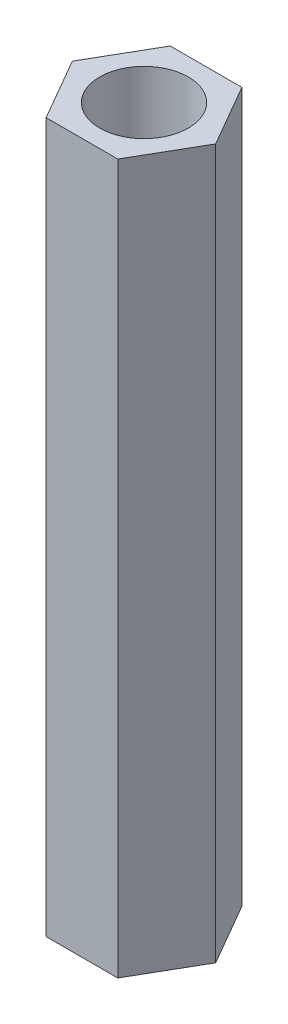
ISO-10303-21;
HEADER;
FILE_DESCRIPTION(('STEP AP214'),'2;1');
FILE_NAME('part.step','',(''),(''),'','','');
FILE_SCHEMA(('AUTOMOTIVE_DESIGN { 1 0 10303 214 1 1 1 1 }'));
ENDSEC;
DATA;
#1=APPLICATION_CONTEXT('core data for automotive mechanical design processes');
#2=APPLICATION_PROTOCOL_DEFINITION('international standard','automotive_design',2000,#1);
#3=PRODUCT_CONTEXT('',#1,'mechanical');
#4=PRODUCT('Part','Part','',(#3));
#5=PRODUCT_RELATED_PRODUCT_CATEGORY('part','',(#4));
#6=PRODUCT_DEFINITION_FORMATION('','',#4);
#7=PRODUCT_DEFINITION_CONTEXT('part definition',#1,'design');
#8=PRODUCT_DEFINITION('design','',#6,#7);
#9=PRODUCT_DEFINITION_SHAPE('','',#8);
#10=(LENGTH_UNIT() NAMED_UNIT(*) SI_UNIT(.MILLI.,.METRE.));
#11=(NAMED_UNIT(*) PLANE_ANGLE_UNIT() SI_UNIT($,.RADIAN.));
#12=(NAMED_UNIT(*) SI_UNIT($,.STERADIAN.) SOLID_ANGLE_UNIT());
#13=UNCERTAINTY_MEASURE_WITH_UNIT(LENGTH_MEASURE(1.E-05),#10,'distance_accuracy_value','');
#14=(GEOMETRIC_REPRESENTATION_CONTEXT(3) GLOBAL_UNCERTAINTY_ASSIGNED_CONTEXT((#13)) GLOBAL_UNIT_ASSIGNED_CONTEXT((#10,
#11,#12)) REPRESENTATION_CONTEXT('',''));
#15=CARTESIAN_POINT('',(0.,0.,0.));
#16=DIRECTION('',(0.,0.,1.));
#17=DIRECTION('',(1.,0.,0.));
#18=AXIS2_PLACEMENT_3D('',#15,#16,#17);
#19=CARTESIAN_POINT('',(0.,40.,0.));
#20=DIRECTION('',(0.,1.,0.));
#21=DIRECTION('',(0.,0.,1.));
#22=AXIS2_PLACEMENT_3D('',#19,#20,#21);
#23=PLANE('',#22);
#24=DIRECTION('',(-0.5,0.,-0.866025403784438));
#25=VECTOR('',#24,1.);
#26=CARTESIAN_POINT('',(4.04145188432738,40.,0.));
#27=LINE('',#26,#25);
#28=CARTESIAN_POINT('',(4.04145188432738,40.,0.));
#29=VERTEX_POINT('',#28);
#30=CARTESIAN_POINT('',(2.02072594216371,40.,-3.49999999999999));
#31=VERTEX_POINT('',#30);
#32=EDGE_CURVE('E152',#29,#31,#27,.T.);
#33=ORIENTED_EDGE('',*,*,#32,.T.);
#34=DIRECTION('',(-1.,0.,0.));
#35=VECTOR('',#34,1.);
#36=CARTESIAN_POINT('',(2.02072594216371,40.,-3.49999999999999));
#37=LINE('',#36,#35);
#38=CARTESIAN_POINT('',(-2.0207259421637,40.,-3.5));
#39=VERTEX_POINT('',#38);
#40=EDGE_CURVE('E100',#31,#39,#37,.T.);
#41=ORIENTED_EDGE('',*,*,#40,.T.);
#42=DIRECTION('',(-0.500000000000001,0.,0.866025403784438));
#43=VECTOR('',#42,1.);
#44=CARTESIAN_POINT('',(-2.0207259421637,40.,-3.5));
#45=LINE('',#44,#43);
#46=CARTESIAN_POINT('',(-4.04145188432739,40.,0.));
#47=VERTEX_POINT('',#46);
#48=EDGE_CURVE('E113',#39,#47,#45,.T.);
#49=ORIENTED_EDGE('',*,*,#48,.T.);
#50=DIRECTION('',(0.500000000000001,0.,0.866025403784438));
#51=VECTOR('',#50,1.);
#52=CARTESIAN_POINT('',(-4.04145188432739,40.,0.));
#53=LINE('',#52,#51);
#54=CARTESIAN_POINT('',(-2.0207259421637,40.,3.5));
#55=VERTEX_POINT('',#54);
#56=EDGE_CURVE('E107',#47,#55,#53,.T.);
#57=ORIENTED_EDGE('',*,*,#56,.T.);
#58=DIRECTION('',(1.,0.,0.));
#59=VECTOR('',#58,1.);
#60=CARTESIAN_POINT('',(-2.0207259421637,40.,3.5));
#61=LINE('',#60,#59);
#62=CARTESIAN_POINT('',(2.02072594216369,40.,3.5));
#63=VERTEX_POINT('',#62);
#64=EDGE_CURVE('E111',#55,#63,#61,.T.);
#65=ORIENTED_EDGE('',*,*,#64,.T.);
#66=DIRECTION('',(0.5,0.,-0.866025403784438));
#67=VECTOR('',#66,1.);
#68=CARTESIAN_POINT('',(2.02072594216369,40.,3.5));
#69=LINE('',#68,#67);
#70=EDGE_CURVE('E63',#63,#29,#69,.T.);
#71=ORIENTED_EDGE('',*,*,#70,.T.);
#72=EDGE_LOOP('',(#33,#41,#49,#57,#65,#71));
#73=FACE_BOUND('',#72,.T.);
#74=CARTESIAN_POINT('',(0.,40.,0.));
#75=DIRECTION('',(0.,1.,0.));
#76=DIRECTION('',(0.,0.,1.));
#77=AXIS2_PLACEMENT_3D('',#74,#75,#76);
#78=CIRCLE('',#77,2.5);
#79=CARTESIAN_POINT('',(0.,40.,2.5));
#80=VERTEX_POINT('',#79);
#81=EDGE_CURVE('E140',#80,#80,#78,.T.);
#82=ORIENTED_EDGE('',*,*,#81,.F.);
#83=EDGE_LOOP('',(#82));
#84=FACE_BOUND('',#83,.T.);
#85=ADVANCED_FACE('F45',(#73,#84),#23,.T.);
#86=CARTESIAN_POINT('',(0.,0.,0.));
#87=DIRECTION('',(0.,1.,0.));
#88=DIRECTION('',(0.,0.,1.));
#89=AXIS2_PLACEMENT_3D('',#86,#87,#88);
#90=PLANE('',#89);
#91=DIRECTION('',(-0.5,0.,-0.866025403784438));
#92=VECTOR('',#91,1.);
#93=CARTESIAN_POINT('',(4.04145188432738,0.,0.));
#94=LINE('',#93,#92);
#95=CARTESIAN_POINT('',(4.04145188432738,0.,0.));
#96=VERTEX_POINT('',#95);
#97=CARTESIAN_POINT('',(2.02072594216371,0.,-3.49999999999999));
#98=VERTEX_POINT('',#97);
#99=EDGE_CURVE('E135',#96,#98,#94,.T.);
#100=ORIENTED_EDGE('',*,*,#99,.F.);
#101=DIRECTION('',(0.5,0.,-0.866025403784438));
#102=VECTOR('',#101,1.);
#103=CARTESIAN_POINT('',(2.02072594216369,0.,3.5));
#104=LINE('',#103,#102);
#105=CARTESIAN_POINT('',(2.02072594216369,0.,3.5));
#106=VERTEX_POINT('',#105);
#107=EDGE_CURVE('E92',#106,#96,#104,.T.);
#108=ORIENTED_EDGE('',*,*,#107,.F.);
#109=DIRECTION('',(1.,0.,0.));
#110=VECTOR('',#109,1.);
#111=CARTESIAN_POINT('',(-2.0207259421637,0.,3.5));
#112=LINE('',#111,#110);
#113=CARTESIAN_POINT('',(-2.0207259421637,0.,3.5));
#114=VERTEX_POINT('',#113);
#115=EDGE_CURVE('E86',#114,#106,#112,.T.);
#116=ORIENTED_EDGE('',*,*,#115,.F.);
#117=DIRECTION('',(0.500000000000001,0.,0.866025403784438));
#118=VECTOR('',#117,1.);
#119=CARTESIAN_POINT('',(-4.04145188432739,0.,0.));
#120=LINE('',#119,#118);
#121=CARTESIAN_POINT('',(-4.04145188432739,0.,0.));
#122=VERTEX_POINT('',#121);
#123=EDGE_CURVE('E122',#122,#114,#120,.T.);
#124=ORIENTED_EDGE('',*,*,#123,.F.);
#125=DIRECTION('',(-0.500000000000001,0.,0.866025403784438));
#126=VECTOR('',#125,1.);
#127=CARTESIAN_POINT('',(-2.0207259421637,0.,-3.5));
#128=LINE('',#127,#126);
#129=CARTESIAN_POINT('',(-2.0207259421637,0.,-3.5));
#130=VERTEX_POINT('',#129);
#131=EDGE_CURVE('E143',#130,#122,#128,.T.);
#132=ORIENTED_EDGE('',*,*,#131,.F.);
#133=DIRECTION('',(-1.,0.,0.));
#134=VECTOR('',#133,1.);
#135=CARTESIAN_POINT('',(2.02072594216371,0.,-3.49999999999999));
#136=LINE('',#135,#134);
#137=EDGE_CURVE('E139',#98,#130,#136,.T.);
#138=ORIENTED_EDGE('',*,*,#137,.F.);
#139=EDGE_LOOP('',(#100,#108,#116,#124,#132,#138));
#140=FACE_BOUND('',#139,.T.);
#141=CARTESIAN_POINT('',(0.,0.,0.));
#142=DIRECTION('',(0.,1.,0.));
#143=DIRECTION('',(0.,0.,1.));
#144=AXIS2_PLACEMENT_3D('',#141,#142,#143);
#145=CIRCLE('',#144,2.5);
#146=CARTESIAN_POINT('',(0.,0.,2.5));
#147=VERTEX_POINT('',#146);
#148=EDGE_CURVE('E249',#147,#147,#145,.T.);
#149=ORIENTED_EDGE('',*,*,#148,.T.);
#150=EDGE_LOOP('',(#149));
#151=FACE_BOUND('',#150,.T.);
#152=ADVANCED_FACE('F165',(#140,#151),#90,.F.);
#153=CARTESIAN_POINT('',(4.04145188432738,40.,0.));
#154=DIRECTION('',(-0.866025403784439,0.,0.5));
#155=DIRECTION('',(0.5,0.,0.866025403784439));
#156=AXIS2_PLACEMENT_3D('',#153,#154,#155);
#157=PLANE('',#156);
#158=ORIENTED_EDGE('',*,*,#99,.T.);
#159=DIRECTION('',(0.,-1.,0.));
#160=VECTOR('',#159,1.);
#161=CARTESIAN_POINT('',(2.02072594216371,40.,-3.49999999999999));
#162=LINE('',#161,#160);
#163=EDGE_CURVE('E11',#31,#98,#162,.T.);
#164=ORIENTED_EDGE('',*,*,#163,.F.);
#165=ORIENTED_EDGE('',*,*,#32,.F.);
#166=DIRECTION('',(0.,-1.,0.));
#167=VECTOR('',#166,1.);
#168=CARTESIAN_POINT('',(4.04145188432738,40.,0.));
#169=LINE('',#168,#167);
#170=EDGE_CURVE('E131',#29,#96,#169,.T.);
#171=ORIENTED_EDGE('',*,*,#170,.T.);
#172=EDGE_LOOP('',(#158,#164,#165,#171));
#173=FACE_BOUND('',#172,.T.);
#174=ADVANCED_FACE('F47',(#173),#157,.F.);
#175=CARTESIAN_POINT('',(2.02072594216371,40.,-3.49999999999999));
#176=DIRECTION('',(0.,0.,1.));
#177=DIRECTION('',(1.,0.,0.));
#178=AXIS2_PLACEMENT_3D('',#175,#176,#177);
#179=PLANE('',#178);
#180=ORIENTED_EDGE('',*,*,#137,.T.);
#181=DIRECTION('',(0.,-1.,0.));
#182=VECTOR('',#181,1.);
#183=CARTESIAN_POINT('',(-2.0207259421637,40.,-3.5));
#184=LINE('',#183,#182);
#185=EDGE_CURVE('E55',#39,#130,#184,.T.);
#186=ORIENTED_EDGE('',*,*,#185,.F.);
#187=ORIENTED_EDGE('',*,*,#40,.F.);
#188=ORIENTED_EDGE('',*,*,#163,.T.);
#189=EDGE_LOOP('',(#180,#186,#187,#188));
#190=FACE_BOUND('',#189,.T.);
#191=ADVANCED_FACE('F190',(#190),#179,.F.);
#192=CARTESIAN_POINT('',(-2.0207259421637,40.,-3.5));
#193=DIRECTION('',(0.866025403784438,0.,0.500000000000001));
#194=DIRECTION('',(0.500000000000001,0.,-0.866025403784438));
#195=AXIS2_PLACEMENT_3D('',#192,#193,#194);
#196=PLANE('',#195);
#197=ORIENTED_EDGE('',*,*,#131,.T.);
#198=DIRECTION('',(0.,-1.,0.));
#199=VECTOR('',#198,1.);
#200=CARTESIAN_POINT('',(-4.04145188432739,40.,0.));
#201=LINE('',#200,#199);
#202=EDGE_CURVE('E124',#47,#122,#201,.T.);
#203=ORIENTED_EDGE('',*,*,#202,.F.);
#204=ORIENTED_EDGE('',*,*,#48,.F.);
#205=ORIENTED_EDGE('',*,*,#185,.T.);
#206=EDGE_LOOP('',(#197,#203,#204,#205));
#207=FACE_BOUND('',#206,.T.);
#208=ADVANCED_FACE('F162',(#207),#196,.F.);
#209=CARTESIAN_POINT('',(-4.04145188432739,40.,0.));
#210=DIRECTION('',(0.866025403784438,0.,-0.500000000000001));
#211=DIRECTION('',(-0.500000000000001,0.,-0.866025403784438));
#212=AXIS2_PLACEMENT_3D('',#209,#210,#211);
#213=PLANE('',#212);
#214=ORIENTED_EDGE('',*,*,#123,.T.);
#215=DIRECTION('',(0.,-1.,0.));
#216=VECTOR('',#215,1.);
#217=CARTESIAN_POINT('',(-2.0207259421637,40.,3.5));
#218=LINE('',#217,#216);
#219=EDGE_CURVE('E119',#55,#114,#218,.T.);
#220=ORIENTED_EDGE('',*,*,#219,.F.);
#221=ORIENTED_EDGE('',*,*,#56,.F.);
#222=ORIENTED_EDGE('',*,*,#202,.T.);
#223=EDGE_LOOP('',(#214,#220,#221,#222));
#224=FACE_BOUND('',#223,.T.);
#225=ADVANCED_FACE('F120',(#224),#213,.F.);
#226=CARTESIAN_POINT('',(-2.0207259421637,40.,3.5));
#227=DIRECTION('',(0.,0.,-1.));
#228=DIRECTION('',(-1.,0.,0.));
#229=AXIS2_PLACEMENT_3D('',#226,#227,#228);
#230=PLANE('',#229);
#231=ORIENTED_EDGE('',*,*,#115,.T.);
#232=DIRECTION('',(0.,-1.,0.));
#233=VECTOR('',#232,1.);
#234=CARTESIAN_POINT('',(2.02072594216369,40.,3.5));
#235=LINE('',#234,#233);
#236=EDGE_CURVE('E125',#63,#106,#235,.T.);
#237=ORIENTED_EDGE('',*,*,#236,.F.);
#238=ORIENTED_EDGE('',*,*,#64,.F.);
#239=ORIENTED_EDGE('',*,*,#219,.T.);
#240=EDGE_LOOP('',(#231,#237,#238,#239));
#241=FACE_BOUND('',#240,.T.);
#242=ADVANCED_FACE('F127',(#241),#230,.F.);
#243=CARTESIAN_POINT('',(2.02072594216369,40.,3.5));
#244=DIRECTION('',(-0.866025403784439,0.,-0.5));
#245=DIRECTION('',(-0.5,0.,0.866025403784439));
#246=AXIS2_PLACEMENT_3D('',#243,#244,#245);
#247=PLANE('',#246);
#248=ORIENTED_EDGE('',*,*,#107,.T.);
#249=ORIENTED_EDGE('',*,*,#170,.F.);
#250=ORIENTED_EDGE('',*,*,#70,.F.);
#251=ORIENTED_EDGE('',*,*,#236,.T.);
#252=EDGE_LOOP('',(#248,#249,#250,#251));
#253=FACE_BOUND('',#252,.T.);
#254=ADVANCED_FACE('F170',(#253),#247,.F.);
#255=CARTESIAN_POINT('',(0.,40.,0.));
#256=DIRECTION('',(0.,-1.,0.));
#257=DIRECTION('',(0.,0.,-1.));
#258=AXIS2_PLACEMENT_3D('',#255,#256,#257);
#259=CYLINDRICAL_SURFACE('',#258,2.5);
#260=ORIENTED_EDGE('',*,*,#81,.T.);
#261=EDGE_LOOP('',(#260));
#262=FACE_BOUND('',#261,.T.);
#263=ORIENTED_EDGE('',*,*,#148,.F.);
#264=EDGE_LOOP('',(#263));
#265=FACE_BOUND('',#264,.T.);
#266=ADVANCED_FACE('F172',(#262,#265),#259,.F.);
#267=CLOSED_SHELL('',(#85,#152,#174,#191,#208,#225,#242,#254,#266));
#268=MANIFOLD_SOLID_BREP('B2',#267);
#269=ADVANCED_BREP_SHAPE_REPRESENTATION('',(#18,#268),#14);
#270=SHAPE_DEFINITION_REPRESENTATION(#9,#269);
ENDSEC;
END-ISO-10303-21;
